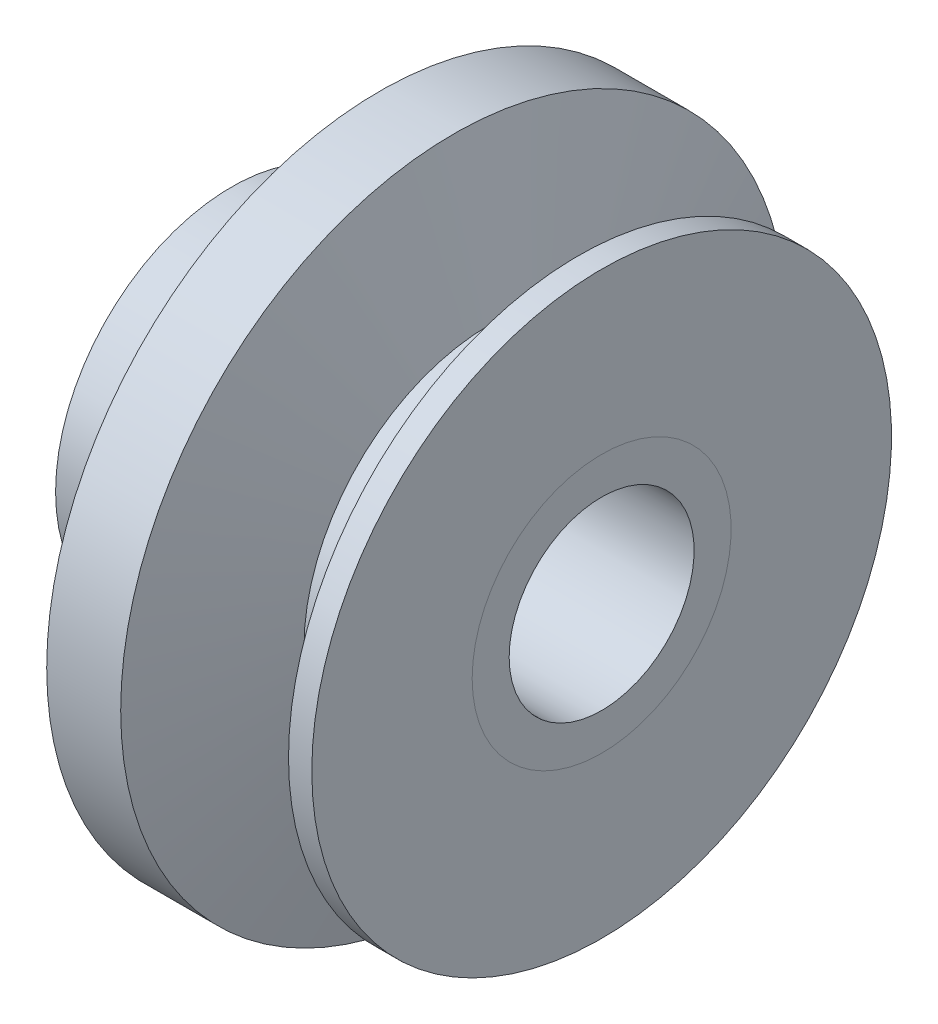
ISO-10303-21;
HEADER;
FILE_DESCRIPTION(('STEP AP214'),'2;1');
FILE_NAME('part.step','',(''),(''),'','','');
FILE_SCHEMA(('AUTOMOTIVE_DESIGN { 1 0 10303 214 1 1 1 1 }'));
ENDSEC;
DATA;
#1=APPLICATION_CONTEXT('core data for automotive mechanical design processes');
#2=APPLICATION_PROTOCOL_DEFINITION('international standard','automotive_design',2000,#1);
#3=PRODUCT_CONTEXT('',#1,'mechanical');
#4=PRODUCT('Part','Part','',(#3));
#5=PRODUCT_RELATED_PRODUCT_CATEGORY('part','',(#4));
#6=PRODUCT_DEFINITION_FORMATION('','',#4);
#7=PRODUCT_DEFINITION_CONTEXT('part definition',#1,'design');
#8=PRODUCT_DEFINITION('design','',#6,#7);
#9=PRODUCT_DEFINITION_SHAPE('','',#8);
#10=(LENGTH_UNIT() NAMED_UNIT(*) SI_UNIT(.MILLI.,.METRE.));
#11=(NAMED_UNIT(*) PLANE_ANGLE_UNIT() SI_UNIT($,.RADIAN.));
#12=(NAMED_UNIT(*) SI_UNIT($,.STERADIAN.) SOLID_ANGLE_UNIT());
#13=UNCERTAINTY_MEASURE_WITH_UNIT(LENGTH_MEASURE(1.E-05),#10,'distance_accuracy_value','');
#14=(GEOMETRIC_REPRESENTATION_CONTEXT(3) GLOBAL_UNCERTAINTY_ASSIGNED_CONTEXT((#13)) GLOBAL_UNIT_ASSIGNED_CONTEXT((#10,
#11,#12)) REPRESENTATION_CONTEXT('',''));
#15=CARTESIAN_POINT('',(0.,0.,0.));
#16=DIRECTION('',(0.,0.,1.));
#17=DIRECTION('',(1.,0.,0.));
#18=AXIS2_PLACEMENT_3D('',#15,#16,#17);
#19=CARTESIAN_POINT('',(-12.7,11.1125,0.));
#20=DIRECTION('',(1.,0.,0.));
#21=DIRECTION('',(0.,0.,-1.));
#22=AXIS2_PLACEMENT_3D('',#19,#20,#21);
#23=PLANE('',#22);
#24=CARTESIAN_POINT('',(-12.7,0.,0.));
#25=DIRECTION('',(-1.,0.,0.));
#26=DIRECTION('',(0.,0.,1.));
#27=AXIS2_PLACEMENT_3D('',#24,#25,#26);
#28=CIRCLE('',#27,7.9375);
#29=CARTESIAN_POINT('',(-12.7,0.,7.9375));
#30=VERTEX_POINT('',#29);
#31=EDGE_CURVE('E11',#30,#30,#28,.T.);
#32=ORIENTED_EDGE('',*,*,#31,.F.);
#33=EDGE_LOOP('',(#32));
#34=FACE_BOUND('',#33,.T.);
#35=CARTESIAN_POINT('',(-12.7,0.,0.));
#36=DIRECTION('',(-1.,0.,0.));
#37=DIRECTION('',(0.,0.,1.));
#38=AXIS2_PLACEMENT_3D('',#35,#36,#37);
#39=CIRCLE('',#38,11.1125);
#40=CARTESIAN_POINT('',(-12.7,0.,11.1125));
#41=VERTEX_POINT('',#40);
#42=EDGE_CURVE('E70',#41,#41,#39,.T.);
#43=ORIENTED_EDGE('',*,*,#42,.T.);
#44=EDGE_LOOP('',(#43));
#45=FACE_BOUND('',#44,.T.);
#46=ADVANCED_FACE('F56',(#34,#45),#23,.F.);
#47=CARTESIAN_POINT('',(0.,0.,0.));
#48=DIRECTION('',(-1.,0.,0.));
#49=DIRECTION('',(0.,0.,1.));
#50=AXIS2_PLACEMENT_3D('',#47,#48,#49);
#51=CYLINDRICAL_SURFACE('',#50,7.9375);
#52=CARTESIAN_POINT('',(0.,0.,0.));
#53=DIRECTION('',(-1.,0.,0.));
#54=DIRECTION('',(0.,0.,1.));
#55=AXIS2_PLACEMENT_3D('',#52,#53,#54);
#56=CIRCLE('',#55,7.9375);
#57=CARTESIAN_POINT('',(0.,0.,7.9375));
#58=VERTEX_POINT('',#57);
#59=EDGE_CURVE('E62',#58,#58,#56,.T.);
#60=ORIENTED_EDGE('',*,*,#59,.F.);
#61=EDGE_LOOP('',(#60));
#62=FACE_BOUND('',#61,.T.);
#63=ORIENTED_EDGE('',*,*,#31,.T.);
#64=EDGE_LOOP('',(#63));
#65=FACE_BOUND('',#64,.T.);
#66=ADVANCED_FACE('F85',(#62,#65),#51,.F.);
#67=CARTESIAN_POINT('',(0.,7.9375,0.));
#68=DIRECTION('',(-1.,0.,0.));
#69=DIRECTION('',(0.,0.,1.));
#70=AXIS2_PLACEMENT_3D('',#67,#68,#69);
#71=PLANE('',#70);
#72=CARTESIAN_POINT('',(0.,0.,0.));
#73=DIRECTION('',(-1.,0.,0.));
#74=DIRECTION('',(0.,0.,1.));
#75=AXIS2_PLACEMENT_3D('',#72,#73,#74);
#76=CIRCLE('',#75,11.1125);
#77=CARTESIAN_POINT('',(0.,0.,11.1125));
#78=VERTEX_POINT('',#77);
#79=EDGE_CURVE('E66',#78,#78,#76,.T.);
#80=ORIENTED_EDGE('',*,*,#79,.F.);
#81=EDGE_LOOP('',(#80));
#82=FACE_BOUND('',#81,.T.);
#83=ORIENTED_EDGE('',*,*,#59,.T.);
#84=EDGE_LOOP('',(#83));
#85=FACE_BOUND('',#84,.T.);
#86=ADVANCED_FACE('F80',(#82,#85),#71,.F.);
#87=CARTESIAN_POINT('',(0.,0.,0.));
#88=DIRECTION('',(-1.,0.,0.));
#89=DIRECTION('',(0.,0.,1.));
#90=AXIS2_PLACEMENT_3D('',#87,#88,#89);
#91=CYLINDRICAL_SURFACE('',#90,11.1125);
#92=ORIENTED_EDGE('',*,*,#42,.F.);
#93=EDGE_LOOP('',(#92));
#94=FACE_BOUND('',#93,.T.);
#95=ORIENTED_EDGE('',*,*,#79,.T.);
#96=EDGE_LOOP('',(#95));
#97=FACE_BOUND('',#96,.T.);
#98=ADVANCED_FACE('F77',(#94,#97),#91,.T.);
#99=CLOSED_SHELL('',(#46,#66,#86,#98));
#100=MANIFOLD_SOLID_BREP('B2',#99);
#101=CARTESIAN_POINT('',(6.35,11.1125,0.));
#102=DIRECTION('',(1.,0.,0.));
#103=DIRECTION('',(0.,0.,-1.));
#104=AXIS2_PLACEMENT_3D('',#101,#102,#103);
#105=PLANE('',#104);
#106=CARTESIAN_POINT('',(6.35,0.,0.));
#107=DIRECTION('',(-1.,0.,0.));
#108=DIRECTION('',(0.,0.,1.));
#109=AXIS2_PLACEMENT_3D('',#106,#107,#108);
#110=CIRCLE('',#109,7.9375);
#111=CARTESIAN_POINT('',(6.35,0.,7.9375));
#112=VERTEX_POINT('',#111);
#113=EDGE_CURVE('E55',#112,#112,#110,.T.);
#114=ORIENTED_EDGE('',*,*,#113,.F.);
#115=EDGE_LOOP('',(#114));
#116=FACE_BOUND('',#115,.T.);
#117=CARTESIAN_POINT('',(6.35,0.,0.));
#118=DIRECTION('',(-1.,0.,0.));
#119=DIRECTION('',(0.,0.,1.));
#120=AXIS2_PLACEMENT_3D('',#117,#118,#119);
#121=CIRCLE('',#120,11.1125);
#122=CARTESIAN_POINT('',(6.35,0.,11.1125));
#123=VERTEX_POINT('',#122);
#124=EDGE_CURVE('E139',#123,#123,#121,.T.);
#125=ORIENTED_EDGE('',*,*,#124,.T.);
#126=EDGE_LOOP('',(#125));
#127=FACE_BOUND('',#126,.T.);
#128=ADVANCED_FACE('F125',(#116,#127),#105,.F.);
#129=CARTESIAN_POINT('',(0.,0.,0.));
#130=DIRECTION('',(-1.,0.,0.));
#131=DIRECTION('',(0.,0.,1.));
#132=AXIS2_PLACEMENT_3D('',#129,#130,#131);
#133=CYLINDRICAL_SURFACE('',#132,7.9375);
#134=CARTESIAN_POINT('',(19.05,0.,0.));
#135=DIRECTION('',(-1.,0.,0.));
#136=DIRECTION('',(0.,0.,1.));
#137=AXIS2_PLACEMENT_3D('',#134,#135,#136);
#138=CIRCLE('',#137,7.9375);
#139=CARTESIAN_POINT('',(19.05,0.,7.9375));
#140=VERTEX_POINT('',#139);
#141=EDGE_CURVE('E131',#140,#140,#138,.T.);
#142=ORIENTED_EDGE('',*,*,#141,.F.);
#143=EDGE_LOOP('',(#142));
#144=FACE_BOUND('',#143,.T.);
#145=ORIENTED_EDGE('',*,*,#113,.T.);
#146=EDGE_LOOP('',(#145));
#147=FACE_BOUND('',#146,.T.);
#148=ADVANCED_FACE('F154',(#144,#147),#133,.F.);
#149=CARTESIAN_POINT('',(19.05,7.9375,0.));
#150=DIRECTION('',(-1.,0.,0.));
#151=DIRECTION('',(0.,0.,1.));
#152=AXIS2_PLACEMENT_3D('',#149,#150,#151);
#153=PLANE('',#152);
#154=CARTESIAN_POINT('',(19.05,0.,0.));
#155=DIRECTION('',(-1.,0.,0.));
#156=DIRECTION('',(0.,0.,1.));
#157=AXIS2_PLACEMENT_3D('',#154,#155,#156);
#158=CIRCLE('',#157,11.1125);
#159=CARTESIAN_POINT('',(19.05,0.,11.1125));
#160=VERTEX_POINT('',#159);
#161=EDGE_CURVE('E135',#160,#160,#158,.T.);
#162=ORIENTED_EDGE('',*,*,#161,.F.);
#163=EDGE_LOOP('',(#162));
#164=FACE_BOUND('',#163,.T.);
#165=ORIENTED_EDGE('',*,*,#141,.T.);
#166=EDGE_LOOP('',(#165));
#167=FACE_BOUND('',#166,.T.);
#168=ADVANCED_FACE('F149',(#164,#167),#153,.F.);
#169=CARTESIAN_POINT('',(0.,0.,0.));
#170=DIRECTION('',(-1.,0.,0.));
#171=DIRECTION('',(0.,0.,1.));
#172=AXIS2_PLACEMENT_3D('',#169,#170,#171);
#173=CYLINDRICAL_SURFACE('',#172,11.1125);
#174=ORIENTED_EDGE('',*,*,#124,.F.);
#175=EDGE_LOOP('',(#174));
#176=FACE_BOUND('',#175,.T.);
#177=ORIENTED_EDGE('',*,*,#161,.T.);
#178=EDGE_LOOP('',(#177));
#179=FACE_BOUND('',#178,.T.);
#180=ADVANCED_FACE('F146',(#176,#179),#173,.T.);
#181=CLOSED_SHELL('',(#128,#148,#168,#180));
#182=MANIFOLD_SOLID_BREP('B6',#181);
#183=CARTESIAN_POINT('',(-12.7,11.1125,0.));
#184=DIRECTION('',(1.,0.,0.));
#185=DIRECTION('',(0.,0.,-1.));
#186=AXIS2_PLACEMENT_3D('',#183,#184,#185);
#187=PLANE('',#186);
#188=CARTESIAN_POINT('',(-12.7,0.,0.));
#189=DIRECTION('',(-1.,0.,0.));
#190=DIRECTION('',(0.,0.,1.));
#191=AXIS2_PLACEMENT_3D('',#188,#189,#190);
#192=CIRCLE('',#191,11.1125);
#193=CARTESIAN_POINT('',(-12.7,0.,11.1125));
#194=VERTEX_POINT('',#193);
#195=EDGE_CURVE('E246',#194,#194,#192,.T.);
#196=ORIENTED_EDGE('',*,*,#195,.F.);
#197=EDGE_LOOP('',(#196));
#198=FACE_BOUND('',#197,.T.);
#199=CARTESIAN_POINT('',(-12.7,0.,0.));
#200=DIRECTION('',(-1.,0.,0.));
#201=DIRECTION('',(0.,0.,1.));
#202=AXIS2_PLACEMENT_3D('',#199,#200,#201);
#203=CIRCLE('',#202,15.112500017);
#204=CARTESIAN_POINT('',(-12.7,0.,15.112500017));
#205=VERTEX_POINT('',#204);
#206=EDGE_CURVE('E124',#205,#205,#203,.T.);
#207=ORIENTED_EDGE('',*,*,#206,.T.);
#208=EDGE_LOOP('',(#207));
#209=FACE_BOUND('',#208,.T.);
#210=ADVANCED_FACE('F187',(#198,#209),#187,.F.);
#211=CARTESIAN_POINT('',(0.,0.,0.));
#212=DIRECTION('',(-1.,0.,0.));
#213=DIRECTION('',(0.,0.,1.));
#214=AXIS2_PLACEMENT_3D('',#211,#212,#213);
#215=CYLINDRICAL_SURFACE('',#214,15.112500017);
#216=ORIENTED_EDGE('',*,*,#206,.F.);
#217=EDGE_LOOP('',(#216));
#218=FACE_BOUND('',#217,.T.);
#219=CARTESIAN_POINT('',(0.,0.,0.));
#220=DIRECTION('',(-1.,0.,0.));
#221=DIRECTION('',(0.,0.,1.));
#222=AXIS2_PLACEMENT_3D('',#219,#220,#221);
#223=CIRCLE('',#222,15.112500017);
#224=CARTESIAN_POINT('',(0.,0.,15.112500017));
#225=VERTEX_POINT('',#224);
#226=EDGE_CURVE('E194',#225,#225,#223,.T.);
#227=ORIENTED_EDGE('',*,*,#226,.T.);
#228=EDGE_LOOP('',(#227));
#229=FACE_BOUND('',#228,.T.);
#230=ADVANCED_FACE('F254',(#218,#229),#215,.T.);
#231=CARTESIAN_POINT('',(0.,15.112500017,0.));
#232=DIRECTION('',(1.,0.,0.));
#233=DIRECTION('',(0.,0.,-1.));
#234=AXIS2_PLACEMENT_3D('',#231,#232,#233);
#235=PLANE('',#234);
#236=ORIENTED_EDGE('',*,*,#226,.F.);
#237=EDGE_LOOP('',(#236));
#238=FACE_BOUND('',#237,.T.);
#239=CARTESIAN_POINT('',(0.,0.,0.));
#240=DIRECTION('',(-1.,0.,0.));
#241=DIRECTION('',(0.,0.,1.));
#242=AXIS2_PLACEMENT_3D('',#239,#240,#241);
#243=CIRCLE('',#242,28.575);
#244=CARTESIAN_POINT('',(0.,0.,28.575));
#245=VERTEX_POINT('',#244);
#246=EDGE_CURVE('E199',#245,#245,#243,.T.);
#247=ORIENTED_EDGE('',*,*,#246,.T.);
#248=EDGE_LOOP('',(#247));
#249=FACE_BOUND('',#248,.T.);
#250=ADVANCED_FACE('F258',(#238,#249),#235,.F.);
#251=CARTESIAN_POINT('',(0.,0.,0.));
#252=DIRECTION('',(-1.,0.,0.));
#253=DIRECTION('',(0.,0.,1.));
#254=AXIS2_PLACEMENT_3D('',#251,#252,#253);
#255=CYLINDRICAL_SURFACE('',#254,28.575);
#256=ORIENTED_EDGE('',*,*,#246,.F.);
#257=EDGE_LOOP('',(#256));
#258=FACE_BOUND('',#257,.T.);
#259=CARTESIAN_POINT('',(6.35,0.,0.));
#260=DIRECTION('',(-1.,0.,0.));
#261=DIRECTION('',(0.,0.,1.));
#262=AXIS2_PLACEMENT_3D('',#259,#260,#261);
#263=CIRCLE('',#262,28.575);
#264=CARTESIAN_POINT('',(6.35,0.,28.575));
#265=VERTEX_POINT('',#264);
#266=EDGE_CURVE('E204',#265,#265,#263,.T.);
#267=ORIENTED_EDGE('',*,*,#266,.T.);
#268=EDGE_LOOP('',(#267));
#269=FACE_BOUND('',#268,.T.);
#270=ADVANCED_FACE('F263',(#258,#269),#255,.T.);
#271=CARTESIAN_POINT('',(9.48903954731846,0.,0.));
#272=DIRECTION('',(-1.,0.,0.));
#273=DIRECTION('',(0.,0.,1.));
#274=AXIS2_PLACEMENT_3D('',#271,#272,#273);
#275=CONICAL_SURFACE('',#274,15.985000034,1.32645023151569);
#276=ORIENTED_EDGE('',*,*,#266,.F.);
#277=EDGE_LOOP('',(#276));
#278=FACE_BOUND('',#277,.T.);
#279=CARTESIAN_POINT('',(9.48903954731846,0.,0.));
#280=DIRECTION('',(-1.,0.,0.));
#281=DIRECTION('',(0.,0.,1.));
#282=AXIS2_PLACEMENT_3D('',#279,#280,#281);
#283=CIRCLE('',#282,15.985000034);
#284=CARTESIAN_POINT('',(9.48903954731846,0.,15.985000034));
#285=VERTEX_POINT('',#284);
#286=EDGE_CURVE('E210',#285,#285,#283,.T.);
#287=ORIENTED_EDGE('',*,*,#286,.T.);
#288=EDGE_LOOP('',(#287));
#289=FACE_BOUND('',#288,.T.);
#290=ADVANCED_FACE('F269',(#278,#289),#275,.T.);
#291=CARTESIAN_POINT('',(0.,0.,0.));
#292=DIRECTION('',(-1.,0.,0.));
#293=DIRECTION('',(0.,0.,1.));
#294=AXIS2_PLACEMENT_3D('',#291,#292,#293);
#295=CYLINDRICAL_SURFACE('',#294,15.985000034);
#296=ORIENTED_EDGE('',*,*,#286,.F.);
#297=EDGE_LOOP('',(#296));
#298=FACE_BOUND('',#297,.T.);
#299=CARTESIAN_POINT('',(14.8349876567668,0.,0.));
#300=DIRECTION('',(-1.,0.,0.));
#301=DIRECTION('',(0.,0.,1.));
#302=AXIS2_PLACEMENT_3D('',#299,#300,#301);
#303=CIRCLE('',#302,15.985000034);
#304=CARTESIAN_POINT('',(14.8349876567668,0.,15.985000034));
#305=VERTEX_POINT('',#304);
#306=EDGE_CURVE('E214',#305,#305,#303,.T.);
#307=ORIENTED_EDGE('',*,*,#306,.T.);
#308=EDGE_LOOP('',(#307));
#309=FACE_BOUND('',#308,.T.);
#310=ADVANCED_FACE('F273',(#298,#309),#295,.T.);
#311=CARTESIAN_POINT('',(17.0515136020426,0.,0.));
#312=DIRECTION('',(1.,0.,0.));
#313=DIRECTION('',(0.,0.,-1.));
#314=AXIS2_PLACEMENT_3D('',#311,#312,#313);
#315=CONICAL_SURFACE('',#314,24.875000034,1.32645023151569);
#316=ORIENTED_EDGE('',*,*,#306,.F.);
#317=EDGE_LOOP('',(#316));
#318=FACE_BOUND('',#317,.T.);
#319=CARTESIAN_POINT('',(17.0515136020426,0.,0.));
#320=DIRECTION('',(-1.,0.,0.));
#321=DIRECTION('',(0.,0.,1.));
#322=AXIS2_PLACEMENT_3D('',#319,#320,#321);
#323=CIRCLE('',#322,24.875000034);
#324=CARTESIAN_POINT('',(17.0515136020426,0.,24.875000034));
#325=VERTEX_POINT('',#324);
#326=EDGE_CURVE('E218',#325,#325,#323,.T.);
#327=ORIENTED_EDGE('',*,*,#326,.T.);
#328=EDGE_LOOP('',(#327));
#329=FACE_BOUND('',#328,.T.);
#330=ADVANCED_FACE('F277',(#318,#329),#315,.T.);
#331=CARTESIAN_POINT('',(0.,0.,0.));
#332=DIRECTION('',(-1.,0.,0.));
#333=DIRECTION('',(0.,0.,1.));
#334=AXIS2_PLACEMENT_3D('',#331,#332,#333);
#335=CYLINDRICAL_SURFACE('',#334,24.875000034);
#336=ORIENTED_EDGE('',*,*,#326,.F.);
#337=EDGE_LOOP('',(#336));
#338=FACE_BOUND('',#337,.T.);
#339=CARTESIAN_POINT('',(19.05,0.,0.));
#340=DIRECTION('',(-1.,0.,0.));
#341=DIRECTION('',(0.,0.,1.));
#342=AXIS2_PLACEMENT_3D('',#339,#340,#341);
#343=CIRCLE('',#342,24.875000034);
#344=CARTESIAN_POINT('',(19.05,0.,24.875000034));
#345=VERTEX_POINT('',#344);
#346=EDGE_CURVE('E222',#345,#345,#343,.T.);
#347=ORIENTED_EDGE('',*,*,#346,.T.);
#348=EDGE_LOOP('',(#347));
#349=FACE_BOUND('',#348,.T.);
#350=ADVANCED_FACE('F281',(#338,#349),#335,.T.);
#351=CARTESIAN_POINT('',(19.05,24.875000034,0.));
#352=DIRECTION('',(-1.,0.,0.));
#353=DIRECTION('',(0.,0.,1.));
#354=AXIS2_PLACEMENT_3D('',#351,#352,#353);
#355=PLANE('',#354);
#356=ORIENTED_EDGE('',*,*,#346,.F.);
#357=EDGE_LOOP('',(#356));
#358=FACE_BOUND('',#357,.T.);
#359=CARTESIAN_POINT('',(19.05,0.,0.));
#360=DIRECTION('',(-1.,0.,0.));
#361=DIRECTION('',(0.,0.,1.));
#362=AXIS2_PLACEMENT_3D('',#359,#360,#361);
#363=CIRCLE('',#362,11.1125);
#364=CARTESIAN_POINT('',(19.05,0.,11.1125));
#365=VERTEX_POINT('',#364);
#366=EDGE_CURVE('E226',#365,#365,#363,.T.);
#367=ORIENTED_EDGE('',*,*,#366,.T.);
#368=EDGE_LOOP('',(#367));
#369=FACE_BOUND('',#368,.T.);
#370=ADVANCED_FACE('F285',(#358,#369),#355,.F.);
#371=CARTESIAN_POINT('',(0.,0.,0.));
#372=DIRECTION('',(-1.,0.,0.));
#373=DIRECTION('',(0.,0.,1.));
#374=AXIS2_PLACEMENT_3D('',#371,#372,#373);
#375=CYLINDRICAL_SURFACE('',#374,11.1125);
#376=ORIENTED_EDGE('',*,*,#366,.F.);
#377=EDGE_LOOP('',(#376));
#378=FACE_BOUND('',#377,.T.);
#379=CARTESIAN_POINT('',(6.35,0.,0.));
#380=DIRECTION('',(-1.,0.,0.));
#381=DIRECTION('',(0.,0.,1.));
#382=AXIS2_PLACEMENT_3D('',#379,#380,#381);
#383=CIRCLE('',#382,11.1125);
#384=CARTESIAN_POINT('',(6.35,0.,11.1125));
#385=VERTEX_POINT('',#384);
#386=EDGE_CURVE('E230',#385,#385,#383,.T.);
#387=ORIENTED_EDGE('',*,*,#386,.T.);
#388=EDGE_LOOP('',(#387));
#389=FACE_BOUND('',#388,.T.);
#390=ADVANCED_FACE('F289',(#378,#389),#375,.F.);
#391=CARTESIAN_POINT('',(6.35,11.1125,0.));
#392=DIRECTION('',(-1.,0.,0.));
#393=DIRECTION('',(0.,0.,1.));
#394=AXIS2_PLACEMENT_3D('',#391,#392,#393);
#395=PLANE('',#394);
#396=ORIENTED_EDGE('',*,*,#386,.F.);
#397=EDGE_LOOP('',(#396));
#398=FACE_BOUND('',#397,.T.);
#399=CARTESIAN_POINT('',(6.35,0.,0.));
#400=DIRECTION('',(-1.,0.,0.));
#401=DIRECTION('',(0.,0.,1.));
#402=AXIS2_PLACEMENT_3D('',#399,#400,#401);
#403=CIRCLE('',#402,8.9375);
#404=CARTESIAN_POINT('',(6.35,0.,8.9375));
#405=VERTEX_POINT('',#404);
#406=EDGE_CURVE('E234',#405,#405,#403,.T.);
#407=ORIENTED_EDGE('',*,*,#406,.T.);
#408=EDGE_LOOP('',(#407));
#409=FACE_BOUND('',#408,.T.);
#410=ADVANCED_FACE('F293',(#398,#409),#395,.F.);
#411=CARTESIAN_POINT('',(0.,0.,0.));
#412=DIRECTION('',(-1.,0.,0.));
#413=DIRECTION('',(0.,0.,1.));
#414=AXIS2_PLACEMENT_3D('',#411,#412,#413);
#415=CYLINDRICAL_SURFACE('',#414,8.9375);
#416=ORIENTED_EDGE('',*,*,#406,.F.);
#417=EDGE_LOOP('',(#416));
#418=FACE_BOUND('',#417,.T.);
#419=CARTESIAN_POINT('',(0.,0.,0.));
#420=DIRECTION('',(-1.,0.,0.));
#421=DIRECTION('',(0.,0.,1.));
#422=AXIS2_PLACEMENT_3D('',#419,#420,#421);
#423=CIRCLE('',#422,8.9375);
#424=CARTESIAN_POINT('',(0.,0.,8.9375));
#425=VERTEX_POINT('',#424);
#426=EDGE_CURVE('E238',#425,#425,#423,.T.);
#427=ORIENTED_EDGE('',*,*,#426,.T.);
#428=EDGE_LOOP('',(#427));
#429=FACE_BOUND('',#428,.T.);
#430=ADVANCED_FACE('F297',(#418,#429),#415,.F.);
#431=CARTESIAN_POINT('',(0.,8.9375,0.));
#432=DIRECTION('',(1.,0.,0.));
#433=DIRECTION('',(0.,0.,-1.));
#434=AXIS2_PLACEMENT_3D('',#431,#432,#433);
#435=PLANE('',#434);
#436=ORIENTED_EDGE('',*,*,#426,.F.);
#437=EDGE_LOOP('',(#436));
#438=FACE_BOUND('',#437,.T.);
#439=CARTESIAN_POINT('',(0.,0.,0.));
#440=DIRECTION('',(-1.,0.,0.));
#441=DIRECTION('',(0.,0.,1.));
#442=AXIS2_PLACEMENT_3D('',#439,#440,#441);
#443=CIRCLE('',#442,11.1125);
#444=CARTESIAN_POINT('',(0.,0.,11.1125));
#445=VERTEX_POINT('',#444);
#446=EDGE_CURVE('E242',#445,#445,#443,.T.);
#447=ORIENTED_EDGE('',*,*,#446,.T.);
#448=EDGE_LOOP('',(#447));
#449=FACE_BOUND('',#448,.T.);
#450=ADVANCED_FACE('F301',(#438,#449),#435,.F.);
#451=CARTESIAN_POINT('',(0.,0.,0.));
#452=DIRECTION('',(-1.,0.,0.));
#453=DIRECTION('',(0.,0.,1.));
#454=AXIS2_PLACEMENT_3D('',#451,#452,#453);
#455=CYLINDRICAL_SURFACE('',#454,11.1125);
#456=ORIENTED_EDGE('',*,*,#446,.F.);
#457=EDGE_LOOP('',(#456));
#458=FACE_BOUND('',#457,.T.);
#459=ORIENTED_EDGE('',*,*,#195,.T.);
#460=EDGE_LOOP('',(#459));
#461=FACE_BOUND('',#460,.T.);
#462=ADVANCED_FACE('F251',(#458,#461),#455,.F.);
#463=CLOSED_SHELL('',(#210,#230,#250,#270,#290,#310,#330,#350,#370,#390,#410,#430,#450,#462));
#464=MANIFOLD_SOLID_BREP('B50',#463);
#465=ADVANCED_BREP_SHAPE_REPRESENTATION('',(#18,#100,#182,#464),#14);
#466=SHAPE_DEFINITION_REPRESENTATION(#9,#465);
ENDSEC;
END-ISO-10303-21;
